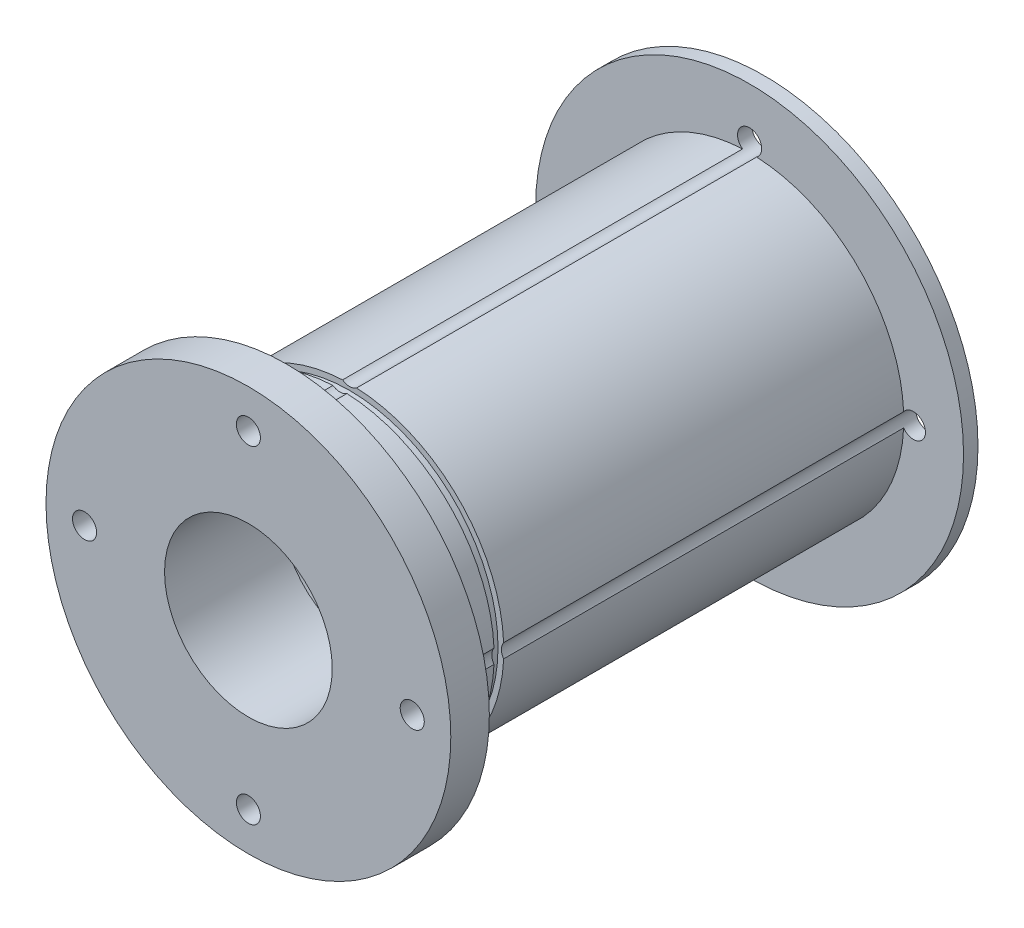
ISO-10303-21;
HEADER;
FILE_DESCRIPTION(('STEP AP214'),'2;1');
FILE_NAME('part.step','',(''),(''),'','','');
FILE_SCHEMA(('AUTOMOTIVE_DESIGN { 1 0 10303 214 1 1 1 1 }'));
ENDSEC;
DATA;
#1=APPLICATION_CONTEXT('core data for automotive mechanical design processes');
#2=APPLICATION_PROTOCOL_DEFINITION('international standard','automotive_design',2000,#1);
#3=PRODUCT_CONTEXT('',#1,'mechanical');
#4=PRODUCT('Part','Part','',(#3));
#5=PRODUCT_RELATED_PRODUCT_CATEGORY('part','',(#4));
#6=PRODUCT_DEFINITION_FORMATION('','',#4);
#7=PRODUCT_DEFINITION_CONTEXT('part definition',#1,'design');
#8=PRODUCT_DEFINITION('design','',#6,#7);
#9=PRODUCT_DEFINITION_SHAPE('','',#8);
#10=(LENGTH_UNIT() NAMED_UNIT(*) SI_UNIT(.MILLI.,.METRE.));
#11=(NAMED_UNIT(*) PLANE_ANGLE_UNIT() SI_UNIT($,.RADIAN.));
#12=(NAMED_UNIT(*) SI_UNIT($,.STERADIAN.) SOLID_ANGLE_UNIT());
#13=UNCERTAINTY_MEASURE_WITH_UNIT(LENGTH_MEASURE(1.E-05),#10,'distance_accuracy_value','');
#14=(GEOMETRIC_REPRESENTATION_CONTEXT(3) GLOBAL_UNCERTAINTY_ASSIGNED_CONTEXT((#13)) GLOBAL_UNIT_ASSIGNED_CONTEXT((#10,
#11,#12)) REPRESENTATION_CONTEXT('',''));
#15=CARTESIAN_POINT('',(0.,0.,0.));
#16=DIRECTION('',(0.,0.,1.));
#17=DIRECTION('',(1.,0.,0.));
#18=AXIS2_PLACEMENT_3D('',#15,#16,#17);
#19=CARTESIAN_POINT('',(0.,0.,28.));
#20=DIRECTION('',(0.,0.,-1.));
#21=DIRECTION('',(-1.,0.,0.));
#22=AXIS2_PLACEMENT_3D('',#19,#20,#21);
#23=CYLINDRICAL_SURFACE('',#22,16.);
#24=CARTESIAN_POINT('',(0.,0.,-20.));
#25=DIRECTION('',(0.,0.,1.));
#26=DIRECTION('',(1.,0.,0.));
#27=AXIS2_PLACEMENT_3D('',#24,#25,#26);
#28=CIRCLE('',#27,16.);
#29=CARTESIAN_POINT('',(0.727418763077474,-15.9834558823529,-20.));
#30=VERTEX_POINT('',#29);
#31=CARTESIAN_POINT('',(15.9834558823529,-0.727418763077469,-20.));
#32=VERTEX_POINT('',#31);
#33=EDGE_CURVE('E239',#30,#32,#28,.T.);
#34=ORIENTED_EDGE('',*,*,#33,.T.);
#35=DIRECTION('',(0.,0.,1.));
#36=VECTOR('',#35,1.);
#37=CARTESIAN_POINT('',(15.9834558823529,-0.727418763077475,0.));
#38=LINE('',#37,#36);
#39=CARTESIAN_POINT('',(15.9834558823529,-0.727418763077475,21.5));
#40=VERTEX_POINT('',#39);
#41=EDGE_CURVE('E233',#32,#40,#38,.T.);
#42=ORIENTED_EDGE('',*,*,#41,.T.);
#43=CARTESIAN_POINT('',(0.,0.,21.5));
#44=DIRECTION('',(0.,0.,1.));
#45=DIRECTION('',(1.,0.,0.));
#46=AXIS2_PLACEMENT_3D('',#43,#44,#45);
#47=CIRCLE('',#46,16.);
#48=CARTESIAN_POINT('',(0.727418763077472,-15.9834558823529,21.5));
#49=VERTEX_POINT('',#48);
#50=EDGE_CURVE('E184',#49,#40,#47,.T.);
#51=ORIENTED_EDGE('',*,*,#50,.F.);
#52=DIRECTION('',(0.,0.,1.));
#53=VECTOR('',#52,1.);
#54=CARTESIAN_POINT('',(0.727418763077471,-15.9834558823529,0.));
#55=LINE('',#54,#53);
#56=EDGE_CURVE('E157',#49,#30,#55,.F.);
#57=ORIENTED_EDGE('',*,*,#56,.T.);
#58=EDGE_LOOP('',(#34,#42,#51,#57));
#59=FACE_BOUND('',#58,.T.);
#60=ADVANCED_FACE('F38',(#59),#23,.T.);
#61=CARTESIAN_POINT('',(15.9834558823529,0.727418763077475,21.5));
#62=VERTEX_POINT('',#61);
#63=CARTESIAN_POINT('',(0.727418763077476,15.9834558823529,21.5));
#64=VERTEX_POINT('',#63);
#65=EDGE_CURVE('E189',#62,#64,#47,.T.);
#66=ORIENTED_EDGE('',*,*,#65,.F.);
#67=DIRECTION('',(0.,0.,1.));
#68=VECTOR('',#67,1.);
#69=CARTESIAN_POINT('',(15.9834558823529,0.727418763077475,0.));
#70=LINE('',#69,#68);
#71=CARTESIAN_POINT('',(15.9834558823529,0.727418763077473,-20.));
#72=VERTEX_POINT('',#71);
#73=EDGE_CURVE('E235',#62,#72,#70,.F.);
#74=ORIENTED_EDGE('',*,*,#73,.T.);
#75=CARTESIAN_POINT('',(0.727418763077473,15.9834558823529,-20.));
#76=VERTEX_POINT('',#75);
#77=EDGE_CURVE('E225',#72,#76,#28,.T.);
#78=ORIENTED_EDGE('',*,*,#77,.T.);
#79=DIRECTION('',(0.,0.,1.));
#80=VECTOR('',#79,1.);
#81=CARTESIAN_POINT('',(0.727418763077475,15.9834558823529,0.));
#82=LINE('',#81,#80);
#83=EDGE_CURVE('E214',#76,#64,#82,.T.);
#84=ORIENTED_EDGE('',*,*,#83,.T.);
#85=EDGE_LOOP('',(#66,#74,#78,#84));
#86=FACE_BOUND('',#85,.T.);
#87=ADVANCED_FACE('F222',(#86),#23,.T.);
#88=CARTESIAN_POINT('',(-0.727418763077474,15.9834558823529,21.5));
#89=VERTEX_POINT('',#88);
#90=CARTESIAN_POINT('',(-15.9834558823529,0.727418763077477,21.5));
#91=VERTEX_POINT('',#90);
#92=EDGE_CURVE('E183',#89,#91,#47,.T.);
#93=ORIENTED_EDGE('',*,*,#92,.F.);
#94=DIRECTION('',(0.,0.,1.));
#95=VECTOR('',#94,1.);
#96=CARTESIAN_POINT('',(-0.727418763077473,15.9834558823529,0.));
#97=LINE('',#96,#95);
#98=CARTESIAN_POINT('',(-0.727418763077472,15.9834558823529,-20.));
#99=VERTEX_POINT('',#98);
#100=EDGE_CURVE('E217',#89,#99,#97,.F.);
#101=ORIENTED_EDGE('',*,*,#100,.T.);
#102=CARTESIAN_POINT('',(-15.9834558823529,0.727418763077477,-20.));
#103=VERTEX_POINT('',#102);
#104=EDGE_CURVE('E318',#99,#103,#28,.T.);
#105=ORIENTED_EDGE('',*,*,#104,.T.);
#106=DIRECTION('',(0.,0.,1.));
#107=VECTOR('',#106,1.);
#108=CARTESIAN_POINT('',(-15.9834558823529,0.727418763077477,0.));
#109=LINE('',#108,#107);
#110=EDGE_CURVE('E439',#103,#91,#109,.T.);
#111=ORIENTED_EDGE('',*,*,#110,.T.);
#112=EDGE_LOOP('',(#93,#101,#105,#111));
#113=FACE_BOUND('',#112,.T.);
#114=ADVANCED_FACE('F367',(#113),#23,.T.);
#115=CARTESIAN_POINT('',(0.,0.,22.5));
#116=DIRECTION('',(0.,0.,1.));
#117=DIRECTION('',(1.,0.,0.));
#118=AXIS2_PLACEMENT_3D('',#115,#116,#117);
#119=CIRCLE('',#118,16.);
#120=CARTESIAN_POINT('',(0.727418763077472,-15.9834558823529,22.5));
#121=VERTEX_POINT('',#120);
#122=CARTESIAN_POINT('',(15.9834558823529,-0.727418763077475,22.5));
#123=VERTEX_POINT('',#122);
#124=EDGE_CURVE('E196',#121,#123,#119,.T.);
#125=ORIENTED_EDGE('',*,*,#124,.T.);
#126=DIRECTION('',(0.,0.,1.));
#127=VECTOR('',#126,1.);
#128=CARTESIAN_POINT('',(15.9834558823529,-0.727418763077475,0.));
#129=LINE('',#128,#127);
#130=CARTESIAN_POINT('',(15.9834558823529,-0.727418763077469,28.));
#131=VERTEX_POINT('',#130);
#132=EDGE_CURVE('E54',#123,#131,#129,.T.);
#133=ORIENTED_EDGE('',*,*,#132,.T.);
#134=CARTESIAN_POINT('',(0.,0.,28.));
#135=DIRECTION('',(0.,0.,1.));
#136=DIRECTION('',(1.,0.,0.));
#137=AXIS2_PLACEMENT_3D('',#134,#135,#136);
#138=CIRCLE('',#137,16.);
#139=CARTESIAN_POINT('',(0.727418763077474,-15.9834558823529,28.));
#140=VERTEX_POINT('',#139);
#141=EDGE_CURVE('E317',#140,#131,#138,.T.);
#142=ORIENTED_EDGE('',*,*,#141,.F.);
#143=DIRECTION('',(0.,0.,1.));
#144=VECTOR('',#143,1.);
#145=CARTESIAN_POINT('',(0.727418763077471,-15.9834558823529,0.));
#146=LINE('',#145,#144);
#147=EDGE_CURVE('E413',#140,#121,#146,.F.);
#148=ORIENTED_EDGE('',*,*,#147,.T.);
#149=EDGE_LOOP('',(#125,#133,#142,#148));
#150=FACE_BOUND('',#149,.T.);
#151=ADVANCED_FACE('F385',(#150),#23,.T.);
#152=CARTESIAN_POINT('',(15.9834558823529,0.727418763077473,28.));
#153=VERTEX_POINT('',#152);
#154=CARTESIAN_POINT('',(0.727418763077473,15.9834558823529,28.));
#155=VERTEX_POINT('',#154);
#156=EDGE_CURVE('E164',#153,#155,#138,.T.);
#157=ORIENTED_EDGE('',*,*,#156,.F.);
#158=DIRECTION('',(0.,0.,1.));
#159=VECTOR('',#158,1.);
#160=CARTESIAN_POINT('',(15.9834558823529,0.727418763077475,0.));
#161=LINE('',#160,#159);
#162=CARTESIAN_POINT('',(15.9834558823529,0.727418763077475,22.5));
#163=VERTEX_POINT('',#162);
#164=EDGE_CURVE('E254',#153,#163,#161,.F.);
#165=ORIENTED_EDGE('',*,*,#164,.T.);
#166=CARTESIAN_POINT('',(0.727418763077476,15.9834558823529,22.5));
#167=VERTEX_POINT('',#166);
#168=EDGE_CURVE('E199',#163,#167,#119,.T.);
#169=ORIENTED_EDGE('',*,*,#168,.T.);
#170=DIRECTION('',(0.,0.,1.));
#171=VECTOR('',#170,1.);
#172=CARTESIAN_POINT('',(0.727418763077475,15.9834558823529,0.));
#173=LINE('',#172,#171);
#174=EDGE_CURVE('E459',#167,#155,#173,.T.);
#175=ORIENTED_EDGE('',*,*,#174,.T.);
#176=EDGE_LOOP('',(#157,#165,#169,#175));
#177=FACE_BOUND('',#176,.T.);
#178=ADVANCED_FACE('F380',(#177),#23,.T.);
#179=CARTESIAN_POINT('',(-0.727418763077472,15.9834558823529,28.));
#180=VERTEX_POINT('',#179);
#181=CARTESIAN_POINT('',(-15.9834558823529,0.727418763077477,28.));
#182=VERTEX_POINT('',#181);
#183=EDGE_CURVE('E322',#180,#182,#138,.T.);
#184=ORIENTED_EDGE('',*,*,#183,.F.);
#185=DIRECTION('',(0.,0.,1.));
#186=VECTOR('',#185,1.);
#187=CARTESIAN_POINT('',(-0.727418763077473,15.9834558823529,0.));
#188=LINE('',#187,#186);
#189=CARTESIAN_POINT('',(-0.727418763077474,15.9834558823529,22.5));
#190=VERTEX_POINT('',#189);
#191=EDGE_CURVE('E392',#180,#190,#188,.F.);
#192=ORIENTED_EDGE('',*,*,#191,.T.);
#193=CARTESIAN_POINT('',(-15.9834558823529,0.727418763077477,22.5));
#194=VERTEX_POINT('',#193);
#195=EDGE_CURVE('E203',#190,#194,#119,.T.);
#196=ORIENTED_EDGE('',*,*,#195,.T.);
#197=DIRECTION('',(0.,0.,1.));
#198=VECTOR('',#197,1.);
#199=CARTESIAN_POINT('',(-15.9834558823529,0.727418763077477,0.));
#200=LINE('',#199,#198);
#201=EDGE_CURVE('E394',#194,#182,#200,.T.);
#202=ORIENTED_EDGE('',*,*,#201,.T.);
#203=EDGE_LOOP('',(#184,#192,#196,#202));
#204=FACE_BOUND('',#203,.T.);
#205=ADVANCED_FACE('F376',(#204),#23,.T.);
#206=CARTESIAN_POINT('',(-15.9834558823529,-0.727418763077473,21.5));
#207=VERTEX_POINT('',#206);
#208=CARTESIAN_POINT('',(-0.727418763077478,-15.9834558823529,21.5));
#209=VERTEX_POINT('',#208);
#210=EDGE_CURVE('E171',#207,#209,#47,.T.);
#211=ORIENTED_EDGE('',*,*,#210,.F.);
#212=DIRECTION('',(0.,0.,1.));
#213=VECTOR('',#212,1.);
#214=CARTESIAN_POINT('',(-15.9834558823529,-0.727418763077473,0.));
#215=LINE('',#214,#213);
#216=CARTESIAN_POINT('',(-15.9834558823529,-0.727418763077475,-20.));
#217=VERTEX_POINT('',#216);
#218=EDGE_CURVE('E783',#207,#217,#215,.F.);
#219=ORIENTED_EDGE('',*,*,#218,.T.);
#220=CARTESIAN_POINT('',(-0.727418763077468,-15.9834558823529,-20.));
#221=VERTEX_POINT('',#220);
#222=EDGE_CURVE('E173',#217,#221,#28,.T.);
#223=ORIENTED_EDGE('',*,*,#222,.T.);
#224=DIRECTION('',(0.,0.,1.));
#225=VECTOR('',#224,1.);
#226=CARTESIAN_POINT('',(-0.727418763077477,-15.9834558823529,0.));
#227=LINE('',#226,#225);
#228=EDGE_CURVE('E154',#221,#209,#227,.T.);
#229=ORIENTED_EDGE('',*,*,#228,.T.);
#230=EDGE_LOOP('',(#211,#219,#223,#229));
#231=FACE_BOUND('',#230,.T.);
#232=ADVANCED_FACE('F169',(#231),#23,.T.);
#233=CARTESIAN_POINT('',(0.,0.,28.));
#234=DIRECTION('',(0.,0.,-1.));
#235=DIRECTION('',(-1.,0.,0.));
#236=AXIS2_PLACEMENT_3D('',#233,#234,#235);
#237=CYLINDRICAL_SURFACE('',#236,8.7);
#238=CARTESIAN_POINT('',(0.,0.,-15.));
#239=DIRECTION('',(0.,0.,1.));
#240=DIRECTION('',(1.,0.,0.));
#241=AXIS2_PLACEMENT_3D('',#238,#239,#240);
#242=CIRCLE('',#241,8.7);
#243=CARTESIAN_POINT('',(8.7,0.,-15.));
#244=VERTEX_POINT('',#243);
#245=EDGE_CURVE('E290',#244,#244,#242,.T.);
#246=ORIENTED_EDGE('',*,*,#245,.F.);
#247=EDGE_LOOP('',(#246));
#248=FACE_BOUND('',#247,.T.);
#249=CARTESIAN_POINT('',(0.,0.,15.));
#250=DIRECTION('',(0.,0.,1.));
#251=DIRECTION('',(1.,0.,0.));
#252=AXIS2_PLACEMENT_3D('',#249,#250,#251);
#253=CIRCLE('',#252,8.7);
#254=CARTESIAN_POINT('',(8.7,0.,15.));
#255=VERTEX_POINT('',#254);
#256=EDGE_CURVE('E283',#255,#255,#253,.T.);
#257=ORIENTED_EDGE('',*,*,#256,.T.);
#258=EDGE_LOOP('',(#257));
#259=FACE_BOUND('',#258,.T.);
#260=ADVANCED_FACE('F341',(#248,#259),#237,.F.);
#261=CARTESIAN_POINT('',(-15.9834558823529,-0.727418763077475,28.));
#262=VERTEX_POINT('',#261);
#263=CARTESIAN_POINT('',(-0.727418763077468,-15.9834558823529,28.));
#264=VERTEX_POINT('',#263);
#265=EDGE_CURVE('E398',#262,#264,#138,.T.);
#266=ORIENTED_EDGE('',*,*,#265,.F.);
#267=DIRECTION('',(0.,0.,1.));
#268=VECTOR('',#267,1.);
#269=CARTESIAN_POINT('',(-15.9834558823529,-0.727418763077473,0.));
#270=LINE('',#269,#268);
#271=CARTESIAN_POINT('',(-15.9834558823529,-0.727418763077473,22.5));
#272=VERTEX_POINT('',#271);
#273=EDGE_CURVE('E433',#262,#272,#270,.F.);
#274=ORIENTED_EDGE('',*,*,#273,.T.);
#275=CARTESIAN_POINT('',(-0.727418763077478,-15.9834558823529,22.5));
#276=VERTEX_POINT('',#275);
#277=EDGE_CURVE('E417',#272,#276,#119,.T.);
#278=ORIENTED_EDGE('',*,*,#277,.T.);
#279=DIRECTION('',(0.,0.,1.));
#280=VECTOR('',#279,1.);
#281=CARTESIAN_POINT('',(-0.727418763077477,-15.9834558823529,0.));
#282=LINE('',#281,#280);
#283=EDGE_CURVE('E62',#276,#264,#282,.T.);
#284=ORIENTED_EDGE('',*,*,#283,.T.);
#285=EDGE_LOOP('',(#266,#274,#278,#284));
#286=FACE_BOUND('',#285,.T.);
#287=ADVANCED_FACE('F40',(#286),#23,.T.);
#288=CARTESIAN_POINT('',(0.,0.,20.));
#289=DIRECTION('',(0.,0.,1.));
#290=DIRECTION('',(1.,0.,0.));
#291=AXIS2_PLACEMENT_3D('',#288,#289,#290);
#292=CIRCLE('',#291,8.7);
#293=CARTESIAN_POINT('',(8.7,0.,20.));
#294=VERTEX_POINT('',#293);
#295=EDGE_CURVE('E197',#294,#294,#292,.T.);
#296=ORIENTED_EDGE('',*,*,#295,.F.);
#297=EDGE_LOOP('',(#296));
#298=FACE_BOUND('',#297,.T.);
#299=CARTESIAN_POINT('',(0.,0.,32.));
#300=DIRECTION('',(0.,0.,1.));
#301=DIRECTION('',(1.,0.,0.));
#302=AXIS2_PLACEMENT_3D('',#299,#300,#301);
#303=CIRCLE('',#302,8.7);
#304=CARTESIAN_POINT('',(8.7,0.,32.));
#305=VERTEX_POINT('',#304);
#306=EDGE_CURVE('E291',#305,#305,#303,.T.);
#307=ORIENTED_EDGE('',*,*,#306,.T.);
#308=EDGE_LOOP('',(#307));
#309=FACE_BOUND('',#308,.T.);
#310=ADVANCED_FACE('F337',(#298,#309),#237,.F.);
#311=CARTESIAN_POINT('',(0.,0.,-20.));
#312=DIRECTION('',(0.,0.,1.));
#313=DIRECTION('',(1.,0.,0.));
#314=AXIS2_PLACEMENT_3D('',#311,#312,#313);
#315=PLANE('',#314);
#316=CARTESIAN_POINT('',(17.,0.,-20.));
#317=DIRECTION('',(0.,0.,1.));
#318=DIRECTION('',(1.,0.,0.));
#319=AXIS2_PLACEMENT_3D('',#316,#317,#318);
#320=CIRCLE('',#319,1.25);
#321=EDGE_CURVE('E241',#32,#72,#320,.T.);
#322=ORIENTED_EDGE('',*,*,#321,.F.);
#323=ORIENTED_EDGE('',*,*,#33,.F.);
#324=CARTESIAN_POINT('',(0.,-17.,-20.));
#325=DIRECTION('',(0.,0.,1.));
#326=DIRECTION('',(1.,0.,0.));
#327=AXIS2_PLACEMENT_3D('',#324,#325,#326);
#328=CIRCLE('',#327,1.25);
#329=EDGE_CURVE('E175',#221,#30,#328,.T.);
#330=ORIENTED_EDGE('',*,*,#329,.F.);
#331=ORIENTED_EDGE('',*,*,#222,.F.);
#332=CARTESIAN_POINT('',(-17.,0.,-20.));
#333=DIRECTION('',(0.,0.,1.));
#334=DIRECTION('',(1.,0.,0.));
#335=AXIS2_PLACEMENT_3D('',#332,#333,#334);
#336=CIRCLE('',#335,1.25);
#337=EDGE_CURVE('E434',#103,#217,#336,.T.);
#338=ORIENTED_EDGE('',*,*,#337,.F.);
#339=ORIENTED_EDGE('',*,*,#104,.F.);
#340=CARTESIAN_POINT('',(0.,17.,-20.));
#341=DIRECTION('',(0.,0.,1.));
#342=DIRECTION('',(1.,0.,0.));
#343=AXIS2_PLACEMENT_3D('',#340,#341,#342);
#344=CIRCLE('',#343,1.25);
#345=EDGE_CURVE('E227',#76,#99,#344,.T.);
#346=ORIENTED_EDGE('',*,*,#345,.F.);
#347=ORIENTED_EDGE('',*,*,#77,.F.);
#348=EDGE_LOOP('',(#322,#323,#330,#331,#338,#339,#346,#347));
#349=FACE_BOUND('',#348,.T.);
#350=CARTESIAN_POINT('',(0.,0.,-20.));
#351=DIRECTION('',(0.,0.,1.));
#352=DIRECTION('',(1.,0.,0.));
#353=AXIS2_PLACEMENT_3D('',#350,#351,#352);
#354=CIRCLE('',#353,22.2);
#355=CARTESIAN_POINT('',(22.2,0.,-20.));
#356=VERTEX_POINT('',#355);
#357=EDGE_CURVE('E308',#356,#356,#354,.T.);
#358=ORIENTED_EDGE('',*,*,#357,.T.);
#359=EDGE_LOOP('',(#358));
#360=FACE_BOUND('',#359,.T.);
#361=ADVANCED_FACE('F340',(#349,#360),#315,.T.);
#362=CARTESIAN_POINT('',(0.,0.,-21.5));
#363=DIRECTION('',(0.,0.,1.));
#364=DIRECTION('',(1.,0.,0.));
#365=AXIS2_PLACEMENT_3D('',#362,#363,#364);
#366=PLANE('',#365);
#367=CARTESIAN_POINT('',(17.,0.,-21.5));
#368=DIRECTION('',(0.,0.,1.));
#369=DIRECTION('',(1.,0.,0.));
#370=AXIS2_PLACEMENT_3D('',#367,#368,#369);
#371=CIRCLE('',#370,1.25);
#372=CARTESIAN_POINT('',(18.25,0.,-21.5));
#373=VERTEX_POINT('',#372);
#374=EDGE_CURVE('E268',#373,#373,#371,.T.);
#375=ORIENTED_EDGE('',*,*,#374,.T.);
#376=EDGE_LOOP('',(#375));
#377=FACE_BOUND('',#376,.T.);
#378=CARTESIAN_POINT('',(0.,17.,-21.5));
#379=DIRECTION('',(0.,0.,1.));
#380=DIRECTION('',(1.,0.,0.));
#381=AXIS2_PLACEMENT_3D('',#378,#379,#380);
#382=CIRCLE('',#381,1.25);
#383=CARTESIAN_POINT('',(1.25,17.,-21.5));
#384=VERTEX_POINT('',#383);
#385=EDGE_CURVE('E248',#384,#384,#382,.T.);
#386=ORIENTED_EDGE('',*,*,#385,.T.);
#387=EDGE_LOOP('',(#386));
#388=FACE_BOUND('',#387,.T.);
#389=CARTESIAN_POINT('',(-17.,0.,-21.5));
#390=DIRECTION('',(0.,0.,1.));
#391=DIRECTION('',(1.,0.,0.));
#392=AXIS2_PLACEMENT_3D('',#389,#390,#391);
#393=CIRCLE('',#392,1.25);
#394=CARTESIAN_POINT('',(-15.75,0.,-21.5));
#395=VERTEX_POINT('',#394);
#396=EDGE_CURVE('E451',#395,#395,#393,.T.);
#397=ORIENTED_EDGE('',*,*,#396,.T.);
#398=EDGE_LOOP('',(#397));
#399=FACE_BOUND('',#398,.T.);
#400=CARTESIAN_POINT('',(0.,-17.,-21.5));
#401=DIRECTION('',(0.,0.,1.));
#402=DIRECTION('',(1.,0.,0.));
#403=AXIS2_PLACEMENT_3D('',#400,#401,#402);
#404=CIRCLE('',#403,1.25);
#405=CARTESIAN_POINT('',(1.25,-17.,-21.5));
#406=VERTEX_POINT('',#405);
#407=EDGE_CURVE('E785',#406,#406,#404,.T.);
#408=ORIENTED_EDGE('',*,*,#407,.T.);
#409=EDGE_LOOP('',(#408));
#410=FACE_BOUND('',#409,.T.);
#411=CARTESIAN_POINT('',(0.,0.,-21.5));
#412=DIRECTION('',(0.,0.,1.));
#413=DIRECTION('',(1.,0.,0.));
#414=AXIS2_PLACEMENT_3D('',#411,#412,#413);
#415=CIRCLE('',#414,22.2);
#416=CARTESIAN_POINT('',(22.2,0.,-21.5));
#417=VERTEX_POINT('',#416);
#418=EDGE_CURVE('E307',#417,#417,#415,.T.);
#419=ORIENTED_EDGE('',*,*,#418,.F.);
#420=EDGE_LOOP('',(#419));
#421=FACE_BOUND('',#420,.T.);
#422=CARTESIAN_POINT('',(0.,0.,-21.5));
#423=DIRECTION('',(0.,0.,1.));
#424=DIRECTION('',(1.,0.,0.));
#425=AXIS2_PLACEMENT_3D('',#422,#423,#424);
#426=CIRCLE('',#425,13.);
#427=CARTESIAN_POINT('',(13.,0.,-21.5));
#428=VERTEX_POINT('',#427);
#429=EDGE_CURVE('E300',#428,#428,#426,.T.);
#430=ORIENTED_EDGE('',*,*,#429,.T.);
#431=EDGE_LOOP('',(#430));
#432=FACE_BOUND('',#431,.T.);
#433=ADVANCED_FACE('F472',(#377,#388,#399,#410,#421,#432),#366,.F.);
#434=CARTESIAN_POINT('',(0.,0.,-20.));
#435=DIRECTION('',(0.,0.,-1.));
#436=DIRECTION('',(-1.,0.,0.));
#437=AXIS2_PLACEMENT_3D('',#434,#435,#436);
#438=CYLINDRICAL_SURFACE('',#437,22.2);
#439=ORIENTED_EDGE('',*,*,#357,.F.);
#440=EDGE_LOOP('',(#439));
#441=FACE_BOUND('',#440,.T.);
#442=ORIENTED_EDGE('',*,*,#418,.T.);
#443=EDGE_LOOP('',(#442));
#444=FACE_BOUND('',#443,.T.);
#445=ADVANCED_FACE('F357',(#441,#444),#438,.T.);
#446=CARTESIAN_POINT('',(0.,0.,-20.));
#447=DIRECTION('',(0.,0.,-1.));
#448=DIRECTION('',(-1.,0.,0.));
#449=AXIS2_PLACEMENT_3D('',#446,#447,#448);
#450=CYLINDRICAL_SURFACE('',#449,13.);
#451=ORIENTED_EDGE('',*,*,#429,.F.);
#452=EDGE_LOOP('',(#451));
#453=FACE_BOUND('',#452,.T.);
#454=CARTESIAN_POINT('',(0.,0.,-15.));
#455=DIRECTION('',(0.,0.,1.));
#456=DIRECTION('',(1.,0.,0.));
#457=AXIS2_PLACEMENT_3D('',#454,#455,#456);
#458=CIRCLE('',#457,13.);
#459=CARTESIAN_POINT('',(13.,0.,-15.));
#460=VERTEX_POINT('',#459);
#461=EDGE_CURVE('E286',#460,#460,#458,.T.);
#462=ORIENTED_EDGE('',*,*,#461,.T.);
#463=EDGE_LOOP('',(#462));
#464=FACE_BOUND('',#463,.T.);
#465=ADVANCED_FACE('F347',(#453,#464),#450,.F.);
#466=CARTESIAN_POINT('',(0.,0.,32.));
#467=DIRECTION('',(0.,0.,1.));
#468=DIRECTION('',(1.,0.,0.));
#469=AXIS2_PLACEMENT_3D('',#466,#467,#468);
#470=PLANE('',#469);
#471=CARTESIAN_POINT('',(17.,0.,32.));
#472=DIRECTION('',(0.,0.,1.));
#473=DIRECTION('',(1.,0.,0.));
#474=AXIS2_PLACEMENT_3D('',#471,#472,#473);
#475=CIRCLE('',#474,1.25);
#476=CARTESIAN_POINT('',(18.25,0.,32.));
#477=VERTEX_POINT('',#476);
#478=EDGE_CURVE('E264',#477,#477,#475,.T.);
#479=ORIENTED_EDGE('',*,*,#478,.F.);
#480=EDGE_LOOP('',(#479));
#481=FACE_BOUND('',#480,.T.);
#482=CARTESIAN_POINT('',(0.,17.,32.));
#483=DIRECTION('',(0.,0.,1.));
#484=DIRECTION('',(1.,0.,0.));
#485=AXIS2_PLACEMENT_3D('',#482,#483,#484);
#486=CIRCLE('',#485,1.25);
#487=CARTESIAN_POINT('',(1.25,17.,32.));
#488=VERTEX_POINT('',#487);
#489=EDGE_CURVE('E465',#488,#488,#486,.T.);
#490=ORIENTED_EDGE('',*,*,#489,.F.);
#491=EDGE_LOOP('',(#490));
#492=FACE_BOUND('',#491,.T.);
#493=CARTESIAN_POINT('',(-17.,0.,32.));
#494=DIRECTION('',(0.,0.,1.));
#495=DIRECTION('',(1.,0.,0.));
#496=AXIS2_PLACEMENT_3D('',#493,#494,#495);
#497=CIRCLE('',#496,1.25);
#498=CARTESIAN_POINT('',(-15.75,0.,32.));
#499=VERTEX_POINT('',#498);
#500=EDGE_CURVE('E447',#499,#499,#497,.T.);
#501=ORIENTED_EDGE('',*,*,#500,.F.);
#502=EDGE_LOOP('',(#501));
#503=FACE_BOUND('',#502,.T.);
#504=CARTESIAN_POINT('',(0.,-17.,32.));
#505=DIRECTION('',(0.,0.,1.));
#506=DIRECTION('',(1.,0.,0.));
#507=AXIS2_PLACEMENT_3D('',#504,#505,#506);
#508=CIRCLE('',#507,1.25);
#509=CARTESIAN_POINT('',(1.25,-17.,32.));
#510=VERTEX_POINT('',#509);
#511=EDGE_CURVE('E504',#510,#510,#508,.T.);
#512=ORIENTED_EDGE('',*,*,#511,.F.);
#513=EDGE_LOOP('',(#512));
#514=FACE_BOUND('',#513,.T.);
#515=CARTESIAN_POINT('',(0.,0.,32.));
#516=DIRECTION('',(0.,0.,1.));
#517=DIRECTION('',(1.,0.,0.));
#518=AXIS2_PLACEMENT_3D('',#515,#516,#517);
#519=CIRCLE('',#518,21.);
#520=CARTESIAN_POINT('',(21.,0.,32.));
#521=VERTEX_POINT('',#520);
#522=EDGE_CURVE('E296',#521,#521,#519,.T.);
#523=ORIENTED_EDGE('',*,*,#522,.T.);
#524=EDGE_LOOP('',(#523));
#525=FACE_BOUND('',#524,.T.);
#526=ORIENTED_EDGE('',*,*,#306,.F.);
#527=EDGE_LOOP('',(#526));
#528=FACE_BOUND('',#527,.T.);
#529=ADVANCED_FACE('F344',(#481,#492,#503,#514,#525,#528),#470,.T.);
#530=CARTESIAN_POINT('',(0.,0.,28.));
#531=DIRECTION('',(0.,0.,1.));
#532=DIRECTION('',(1.,0.,0.));
#533=AXIS2_PLACEMENT_3D('',#530,#531,#532);
#534=PLANE('',#533);
#535=ORIENTED_EDGE('',*,*,#141,.T.);
#536=CARTESIAN_POINT('',(17.,0.,28.));
#537=DIRECTION('',(0.,0.,1.));
#538=DIRECTION('',(1.,0.,0.));
#539=AXIS2_PLACEMENT_3D('',#536,#537,#538);
#540=CIRCLE('',#539,1.25);
#541=EDGE_CURVE('E260',#131,#153,#540,.T.);
#542=ORIENTED_EDGE('',*,*,#541,.T.);
#543=ORIENTED_EDGE('',*,*,#156,.T.);
#544=CARTESIAN_POINT('',(0.,17.,28.));
#545=DIRECTION('',(0.,0.,1.));
#546=DIRECTION('',(1.,0.,0.));
#547=AXIS2_PLACEMENT_3D('',#544,#545,#546);
#548=CIRCLE('',#547,1.25);
#549=EDGE_CURVE('E463',#155,#180,#548,.T.);
#550=ORIENTED_EDGE('',*,*,#549,.T.);
#551=ORIENTED_EDGE('',*,*,#183,.T.);
#552=CARTESIAN_POINT('',(-17.,0.,28.));
#553=DIRECTION('',(0.,0.,1.));
#554=DIRECTION('',(1.,0.,0.));
#555=AXIS2_PLACEMENT_3D('',#552,#553,#554);
#556=CIRCLE('',#555,1.25);
#557=EDGE_CURVE('E444',#182,#262,#556,.T.);
#558=ORIENTED_EDGE('',*,*,#557,.T.);
#559=ORIENTED_EDGE('',*,*,#265,.T.);
#560=CARTESIAN_POINT('',(0.,-17.,28.));
#561=DIRECTION('',(0.,0.,1.));
#562=DIRECTION('',(1.,0.,0.));
#563=AXIS2_PLACEMENT_3D('',#560,#561,#562);
#564=CIRCLE('',#563,1.25);
#565=EDGE_CURVE('E409',#264,#140,#564,.T.);
#566=ORIENTED_EDGE('',*,*,#565,.T.);
#567=EDGE_LOOP('',(#535,#542,#543,#550,#551,#558,#559,#566));
#568=FACE_BOUND('',#567,.T.);
#569=CARTESIAN_POINT('',(0.,0.,28.));
#570=DIRECTION('',(0.,0.,1.));
#571=DIRECTION('',(1.,0.,0.));
#572=AXIS2_PLACEMENT_3D('',#569,#570,#571);
#573=CIRCLE('',#572,21.);
#574=CARTESIAN_POINT('',(21.,0.,28.));
#575=VERTEX_POINT('',#574);
#576=EDGE_CURVE('E295',#575,#575,#573,.T.);
#577=ORIENTED_EDGE('',*,*,#576,.F.);
#578=EDGE_LOOP('',(#577));
#579=FACE_BOUND('',#578,.T.);
#580=ADVANCED_FACE('F346',(#568,#579),#534,.F.);
#581=CARTESIAN_POINT('',(0.,0.,32.));
#582=DIRECTION('',(0.,0.,-1.));
#583=DIRECTION('',(-1.,0.,0.));
#584=AXIS2_PLACEMENT_3D('',#581,#582,#583);
#585=CYLINDRICAL_SURFACE('',#584,21.);
#586=ORIENTED_EDGE('',*,*,#522,.F.);
#587=EDGE_LOOP('',(#586));
#588=FACE_BOUND('',#587,.T.);
#589=ORIENTED_EDGE('',*,*,#576,.T.);
#590=EDGE_LOOP('',(#589));
#591=FACE_BOUND('',#590,.T.);
#592=ADVANCED_FACE('F354',(#588,#591),#585,.T.);
#593=CARTESIAN_POINT('',(0.,0.,-15.));
#594=DIRECTION('',(0.,0.,1.));
#595=DIRECTION('',(1.,0.,0.));
#596=AXIS2_PLACEMENT_3D('',#593,#594,#595);
#597=PLANE('',#596);
#598=ORIENTED_EDGE('',*,*,#245,.T.);
#599=EDGE_LOOP('',(#598));
#600=FACE_BOUND('',#599,.T.);
#601=ORIENTED_EDGE('',*,*,#461,.F.);
#602=EDGE_LOOP('',(#601));
#603=FACE_BOUND('',#602,.T.);
#604=ADVANCED_FACE('F509',(#600,#603),#597,.F.);
#605=CARTESIAN_POINT('',(0.,0.,20.));
#606=DIRECTION('',(0.,0.,-1.));
#607=DIRECTION('',(-1.,0.,0.));
#608=AXIS2_PLACEMENT_3D('',#605,#606,#607);
#609=CYLINDRICAL_SURFACE('',#608,13.);
#610=CARTESIAN_POINT('',(0.,0.,20.));
#611=DIRECTION('',(0.,0.,1.));
#612=DIRECTION('',(1.,0.,0.));
#613=AXIS2_PLACEMENT_3D('',#610,#611,#612);
#614=CIRCLE('',#613,13.);
#615=CARTESIAN_POINT('',(13.,0.,20.));
#616=VERTEX_POINT('',#615);
#617=EDGE_CURVE('E279',#616,#616,#614,.T.);
#618=ORIENTED_EDGE('',*,*,#617,.T.);
#619=EDGE_LOOP('',(#618));
#620=FACE_BOUND('',#619,.T.);
#621=CARTESIAN_POINT('',(0.,0.,15.));
#622=DIRECTION('',(0.,0.,1.));
#623=DIRECTION('',(1.,0.,0.));
#624=AXIS2_PLACEMENT_3D('',#621,#622,#623);
#625=CIRCLE('',#624,13.);
#626=CARTESIAN_POINT('',(13.,0.,15.));
#627=VERTEX_POINT('',#626);
#628=EDGE_CURVE('E202',#627,#627,#625,.T.);
#629=ORIENTED_EDGE('',*,*,#628,.F.);
#630=EDGE_LOOP('',(#629));
#631=FACE_BOUND('',#630,.T.);
#632=ADVANCED_FACE('F515',(#620,#631),#609,.F.);
#633=CARTESIAN_POINT('',(0.,0.,20.));
#634=DIRECTION('',(0.,0.,1.));
#635=DIRECTION('',(1.,0.,0.));
#636=AXIS2_PLACEMENT_3D('',#633,#634,#635);
#637=PLANE('',#636);
#638=ORIENTED_EDGE('',*,*,#295,.T.);
#639=EDGE_LOOP('',(#638));
#640=FACE_BOUND('',#639,.T.);
#641=ORIENTED_EDGE('',*,*,#617,.F.);
#642=EDGE_LOOP('',(#641));
#643=FACE_BOUND('',#642,.T.);
#644=ADVANCED_FACE('F334',(#640,#643),#637,.F.);
#645=CARTESIAN_POINT('',(0.,0.,15.));
#646=DIRECTION('',(0.,0.,1.));
#647=DIRECTION('',(1.,0.,0.));
#648=AXIS2_PLACEMENT_3D('',#645,#646,#647);
#649=PLANE('',#648);
#650=ORIENTED_EDGE('',*,*,#256,.F.);
#651=EDGE_LOOP('',(#650));
#652=FACE_BOUND('',#651,.T.);
#653=ORIENTED_EDGE('',*,*,#628,.T.);
#654=EDGE_LOOP('',(#653));
#655=FACE_BOUND('',#654,.T.);
#656=ADVANCED_FACE('F578',(#652,#655),#649,.T.);
#657=CARTESIAN_POINT('',(0.,0.,22.5));
#658=DIRECTION('',(0.,0.,1.));
#659=DIRECTION('',(1.,0.,0.));
#660=AXIS2_PLACEMENT_3D('',#657,#658,#659);
#661=PLANE('',#660);
#662=CARTESIAN_POINT('',(0.,0.,22.5));
#663=DIRECTION('',(0.,0.,1.));
#664=DIRECTION('',(1.,0.,0.));
#665=AXIS2_PLACEMENT_3D('',#662,#663,#664);
#666=CIRCLE('',#665,15.4);
#667=CARTESIAN_POINT('',(15.4,0.,22.5));
#668=VERTEX_POINT('',#667);
#669=EDGE_CURVE('E191',#668,#668,#666,.T.);
#670=ORIENTED_EDGE('',*,*,#669,.T.);
#671=EDGE_LOOP('',(#670));
#672=FACE_BOUND('',#671,.T.);
#673=ORIENTED_EDGE('',*,*,#168,.F.);
#674=CARTESIAN_POINT('',(17.,0.,22.5));
#675=DIRECTION('',(0.,0.,1.));
#676=DIRECTION('',(1.,0.,0.));
#677=AXIS2_PLACEMENT_3D('',#674,#675,#676);
#678=CIRCLE('',#677,1.25);
#679=EDGE_CURVE('E246',#163,#123,#678,.T.);
#680=ORIENTED_EDGE('',*,*,#679,.T.);
#681=ORIENTED_EDGE('',*,*,#124,.F.);
#682=CARTESIAN_POINT('',(0.,-17.,22.5));
#683=DIRECTION('',(0.,0.,1.));
#684=DIRECTION('',(1.,0.,0.));
#685=AXIS2_PLACEMENT_3D('',#682,#683,#684);
#686=CIRCLE('',#685,1.25);
#687=EDGE_CURVE('E797',#121,#276,#686,.T.);
#688=ORIENTED_EDGE('',*,*,#687,.T.);
#689=ORIENTED_EDGE('',*,*,#277,.F.);
#690=CARTESIAN_POINT('',(-17.,0.,22.5));
#691=DIRECTION('',(0.,0.,1.));
#692=DIRECTION('',(1.,0.,0.));
#693=AXIS2_PLACEMENT_3D('',#690,#691,#692);
#694=CIRCLE('',#693,1.25);
#695=EDGE_CURVE('E430',#272,#194,#694,.T.);
#696=ORIENTED_EDGE('',*,*,#695,.T.);
#697=ORIENTED_EDGE('',*,*,#195,.F.);
#698=CARTESIAN_POINT('',(0.,17.,22.5));
#699=DIRECTION('',(0.,0.,1.));
#700=DIRECTION('',(1.,0.,0.));
#701=AXIS2_PLACEMENT_3D('',#698,#699,#700);
#702=CIRCLE('',#701,1.25);
#703=EDGE_CURVE('E429',#190,#167,#702,.T.);
#704=ORIENTED_EDGE('',*,*,#703,.T.);
#705=EDGE_LOOP('',(#673,#680,#681,#688,#689,#696,#697,#704));
#706=FACE_BOUND('',#705,.T.);
#707=ADVANCED_FACE('F428',(#672,#706),#661,.F.);
#708=CARTESIAN_POINT('',(0.,0.,21.5));
#709=DIRECTION('',(0.,0.,1.));
#710=DIRECTION('',(1.,0.,0.));
#711=AXIS2_PLACEMENT_3D('',#708,#709,#710);
#712=PLANE('',#711);
#713=CARTESIAN_POINT('',(17.,0.,21.5));
#714=DIRECTION('',(0.,0.,1.));
#715=DIRECTION('',(1.,0.,0.));
#716=AXIS2_PLACEMENT_3D('',#713,#714,#715);
#717=CIRCLE('',#716,1.25);
#718=EDGE_CURVE('E11',#62,#40,#717,.T.);
#719=ORIENTED_EDGE('',*,*,#718,.F.);
#720=ORIENTED_EDGE('',*,*,#65,.T.);
#721=CARTESIAN_POINT('',(0.,17.,21.5));
#722=DIRECTION('',(0.,0.,1.));
#723=DIRECTION('',(1.,0.,0.));
#724=AXIS2_PLACEMENT_3D('',#721,#722,#723);
#725=CIRCLE('',#724,1.25);
#726=EDGE_CURVE('E47',#89,#64,#725,.T.);
#727=ORIENTED_EDGE('',*,*,#726,.F.);
#728=ORIENTED_EDGE('',*,*,#92,.T.);
#729=CARTESIAN_POINT('',(-17.,0.,21.5));
#730=DIRECTION('',(0.,0.,1.));
#731=DIRECTION('',(1.,0.,0.));
#732=AXIS2_PLACEMENT_3D('',#729,#730,#731);
#733=CIRCLE('',#732,1.25);
#734=EDGE_CURVE('E163',#207,#91,#733,.T.);
#735=ORIENTED_EDGE('',*,*,#734,.F.);
#736=ORIENTED_EDGE('',*,*,#210,.T.);
#737=CARTESIAN_POINT('',(0.,-17.,21.5));
#738=DIRECTION('',(0.,0.,1.));
#739=DIRECTION('',(1.,0.,0.));
#740=AXIS2_PLACEMENT_3D('',#737,#738,#739);
#741=CIRCLE('',#740,1.25);
#742=EDGE_CURVE('E150',#49,#209,#741,.T.);
#743=ORIENTED_EDGE('',*,*,#742,.F.);
#744=ORIENTED_EDGE('',*,*,#50,.T.);
#745=EDGE_LOOP('',(#719,#720,#727,#728,#735,#736,#743,#744));
#746=FACE_BOUND('',#745,.T.);
#747=CARTESIAN_POINT('',(0.,0.,21.5));
#748=DIRECTION('',(0.,0.,1.));
#749=DIRECTION('',(1.,0.,0.));
#750=AXIS2_PLACEMENT_3D('',#747,#748,#749);
#751=CIRCLE('',#750,15.4);
#752=CARTESIAN_POINT('',(15.4,0.,21.5));
#753=VERTEX_POINT('',#752);
#754=EDGE_CURVE('E272',#753,#753,#751,.T.);
#755=ORIENTED_EDGE('',*,*,#754,.F.);
#756=EDGE_LOOP('',(#755));
#757=FACE_BOUND('',#756,.T.);
#758=ADVANCED_FACE('F179',(#746,#757),#712,.T.);
#759=CARTESIAN_POINT('',(0.,0.,22.5));
#760=DIRECTION('',(0.,0.,-1.));
#761=DIRECTION('',(-1.,0.,0.));
#762=AXIS2_PLACEMENT_3D('',#759,#760,#761);
#763=CYLINDRICAL_SURFACE('',#762,15.4);
#764=ORIENTED_EDGE('',*,*,#669,.F.);
#765=EDGE_LOOP('',(#764));
#766=FACE_BOUND('',#765,.T.);
#767=ORIENTED_EDGE('',*,*,#754,.T.);
#768=EDGE_LOOP('',(#767));
#769=FACE_BOUND('',#768,.T.);
#770=ADVANCED_FACE('F602',(#766,#769),#763,.T.);
#771=CARTESIAN_POINT('',(0.,-17.,-100.));
#772=DIRECTION('',(0.,0.,1.));
#773=DIRECTION('',(1.,0.,0.));
#774=AXIS2_PLACEMENT_3D('',#771,#772,#773);
#775=CYLINDRICAL_SURFACE('',#774,1.25);
#776=ORIENTED_EDGE('',*,*,#329,.T.);
#777=ORIENTED_EDGE('',*,*,#56,.F.);
#778=ORIENTED_EDGE('',*,*,#742,.T.);
#779=ORIENTED_EDGE('',*,*,#228,.F.);
#780=EDGE_LOOP('',(#776,#777,#778,#779));
#781=FACE_BOUND('',#780,.T.);
#782=ORIENTED_EDGE('',*,*,#407,.F.);
#783=EDGE_LOOP('',(#782));
#784=FACE_BOUND('',#783,.T.);
#785=ADVANCED_FACE('F152',(#781,#784),#775,.F.);
#786=CARTESIAN_POINT('',(-17.,0.,-100.));
#787=DIRECTION('',(0.,0.,1.));
#788=DIRECTION('',(1.,0.,0.));
#789=AXIS2_PLACEMENT_3D('',#786,#787,#788);
#790=CYLINDRICAL_SURFACE('',#789,1.25);
#791=ORIENTED_EDGE('',*,*,#337,.T.);
#792=ORIENTED_EDGE('',*,*,#218,.F.);
#793=ORIENTED_EDGE('',*,*,#734,.T.);
#794=ORIENTED_EDGE('',*,*,#110,.F.);
#795=EDGE_LOOP('',(#791,#792,#793,#794));
#796=FACE_BOUND('',#795,.T.);
#797=ORIENTED_EDGE('',*,*,#396,.F.);
#798=EDGE_LOOP('',(#797));
#799=FACE_BOUND('',#798,.T.);
#800=ADVANCED_FACE('F475',(#796,#799),#790,.F.);
#801=CARTESIAN_POINT('',(0.,17.,-100.));
#802=DIRECTION('',(0.,0.,1.));
#803=DIRECTION('',(1.,0.,0.));
#804=AXIS2_PLACEMENT_3D('',#801,#802,#803);
#805=CYLINDRICAL_SURFACE('',#804,1.25);
#806=ORIENTED_EDGE('',*,*,#345,.T.);
#807=ORIENTED_EDGE('',*,*,#100,.F.);
#808=ORIENTED_EDGE('',*,*,#726,.T.);
#809=ORIENTED_EDGE('',*,*,#83,.F.);
#810=EDGE_LOOP('',(#806,#807,#808,#809));
#811=FACE_BOUND('',#810,.T.);
#812=ORIENTED_EDGE('',*,*,#385,.F.);
#813=EDGE_LOOP('',(#812));
#814=FACE_BOUND('',#813,.T.);
#815=ADVANCED_FACE('F212',(#811,#814),#805,.F.);
#816=CARTESIAN_POINT('',(17.,0.,-100.));
#817=DIRECTION('',(0.,0.,1.));
#818=DIRECTION('',(1.,0.,0.));
#819=AXIS2_PLACEMENT_3D('',#816,#817,#818);
#820=CYLINDRICAL_SURFACE('',#819,1.25);
#821=ORIENTED_EDGE('',*,*,#321,.T.);
#822=ORIENTED_EDGE('',*,*,#73,.F.);
#823=ORIENTED_EDGE('',*,*,#718,.T.);
#824=ORIENTED_EDGE('',*,*,#41,.F.);
#825=EDGE_LOOP('',(#821,#822,#823,#824));
#826=FACE_BOUND('',#825,.T.);
#827=ORIENTED_EDGE('',*,*,#374,.F.);
#828=EDGE_LOOP('',(#827));
#829=FACE_BOUND('',#828,.T.);
#830=ADVANCED_FACE('F231',(#826,#829),#820,.F.);
#831=ORIENTED_EDGE('',*,*,#511,.T.);
#832=EDGE_LOOP('',(#831));
#833=FACE_BOUND('',#832,.T.);
#834=ORIENTED_EDGE('',*,*,#283,.F.);
#835=ORIENTED_EDGE('',*,*,#687,.F.);
#836=ORIENTED_EDGE('',*,*,#147,.F.);
#837=ORIENTED_EDGE('',*,*,#565,.F.);
#838=EDGE_LOOP('',(#834,#835,#836,#837));
#839=FACE_BOUND('',#838,.T.);
#840=ADVANCED_FACE('F482',(#833,#839),#775,.F.);
#841=ORIENTED_EDGE('',*,*,#500,.T.);
#842=EDGE_LOOP('',(#841));
#843=FACE_BOUND('',#842,.T.);
#844=ORIENTED_EDGE('',*,*,#201,.F.);
#845=ORIENTED_EDGE('',*,*,#695,.F.);
#846=ORIENTED_EDGE('',*,*,#273,.F.);
#847=ORIENTED_EDGE('',*,*,#557,.F.);
#848=EDGE_LOOP('',(#844,#845,#846,#847));
#849=FACE_BOUND('',#848,.T.);
#850=ADVANCED_FACE('F487',(#843,#849),#790,.F.);
#851=ORIENTED_EDGE('',*,*,#489,.T.);
#852=EDGE_LOOP('',(#851));
#853=FACE_BOUND('',#852,.T.);
#854=ORIENTED_EDGE('',*,*,#174,.F.);
#855=ORIENTED_EDGE('',*,*,#703,.F.);
#856=ORIENTED_EDGE('',*,*,#191,.F.);
#857=ORIENTED_EDGE('',*,*,#549,.F.);
#858=EDGE_LOOP('',(#854,#855,#856,#857));
#859=FACE_BOUND('',#858,.T.);
#860=ADVANCED_FACE('F477',(#853,#859),#805,.F.);
#861=ORIENTED_EDGE('',*,*,#478,.T.);
#862=EDGE_LOOP('',(#861));
#863=FACE_BOUND('',#862,.T.);
#864=ORIENTED_EDGE('',*,*,#132,.F.);
#865=ORIENTED_EDGE('',*,*,#679,.F.);
#866=ORIENTED_EDGE('',*,*,#164,.F.);
#867=ORIENTED_EDGE('',*,*,#541,.F.);
#868=EDGE_LOOP('',(#864,#865,#866,#867));
#869=FACE_BOUND('',#868,.T.);
#870=ADVANCED_FACE('F484',(#863,#869),#820,.F.);
#871=CLOSED_SHELL('',(#60,#87,#114,#151,#178,#205,#232,#260,#287,#310,#361,#433,#445,#465,#529,
#580,#592,#604,#632,#644,#656,#707,#758,#770,#785,#800,#815,#830,#840,#850,#860,#870));
#872=MANIFOLD_SOLID_BREP('B2',#871);
#873=ADVANCED_BREP_SHAPE_REPRESENTATION('',(#18,#872),#14);
#874=SHAPE_DEFINITION_REPRESENTATION(#9,#873);
ENDSEC;
END-ISO-10303-21;
